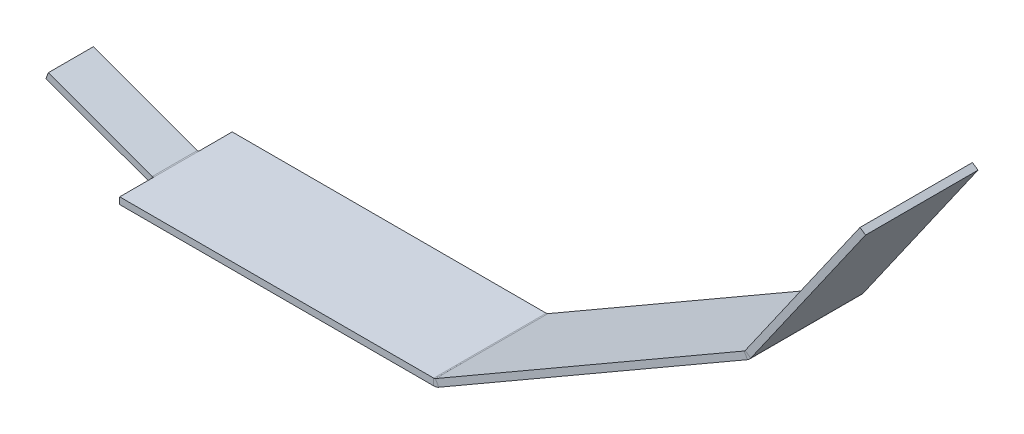
ISO-10303-21;
HEADER;
FILE_DESCRIPTION(('STEP AP214'),'2;1');
FILE_NAME('part.step','',(''),(''),'','','');
FILE_SCHEMA(('AUTOMOTIVE_DESIGN { 1 0 10303 214 1 1 1 1 }'));
ENDSEC;
DATA;
#1=APPLICATION_CONTEXT('core data for automotive mechanical design processes');
#2=APPLICATION_PROTOCOL_DEFINITION('international standard','automotive_design',2000,#1);
#3=PRODUCT_CONTEXT('',#1,'mechanical');
#4=PRODUCT('Part','Part','',(#3));
#5=PRODUCT_RELATED_PRODUCT_CATEGORY('part','',(#4));
#6=PRODUCT_DEFINITION_FORMATION('','',#4);
#7=PRODUCT_DEFINITION_CONTEXT('part definition',#1,'design');
#8=PRODUCT_DEFINITION('design','',#6,#7);
#9=PRODUCT_DEFINITION_SHAPE('','',#8);
#10=(LENGTH_UNIT() NAMED_UNIT(*) SI_UNIT(.MILLI.,.METRE.));
#11=(NAMED_UNIT(*) PLANE_ANGLE_UNIT() SI_UNIT($,.RADIAN.));
#12=(NAMED_UNIT(*) SI_UNIT($,.STERADIAN.) SOLID_ANGLE_UNIT());
#13=UNCERTAINTY_MEASURE_WITH_UNIT(LENGTH_MEASURE(1.E-05),#10,'distance_accuracy_value','');
#14=(GEOMETRIC_REPRESENTATION_CONTEXT(3) GLOBAL_UNCERTAINTY_ASSIGNED_CONTEXT((#13)) GLOBAL_UNIT_ASSIGNED_CONTEXT((#10,
#11,#12)) REPRESENTATION_CONTEXT('',''));
#15=CARTESIAN_POINT('',(0.,0.,0.));
#16=DIRECTION('',(0.,0.,1.));
#17=DIRECTION('',(1.,0.,0.));
#18=AXIS2_PLACEMENT_3D('',#15,#16,#17);
#19=CARTESIAN_POINT('',(35.75,-1.29903810567666,12.5));
#20=DIRECTION('',(0.,0.,-1.));
#21=DIRECTION('',(-1.,0.,0.));
#22=AXIS2_PLACEMENT_3D('',#19,#20,#21);
#23=PLANE('',#22);
#24=DIRECTION('',(0.499999999999991,-0.866025403784444,0.));
#25=VECTOR('',#24,1.);
#26=CARTESIAN_POINT('',(103.792533893113,39.7173879614248,12.5));
#27=LINE('',#26,#25);
#28=CARTESIAN_POINT('',(103.792533893113,39.7173879614248,12.5));
#29=VERTEX_POINT('',#28);
#30=CARTESIAN_POINT('',(104.542533893113,38.4183498557482,12.5));
#31=VERTEX_POINT('',#30);
#32=EDGE_CURVE('E245',#29,#31,#27,.T.);
#33=ORIENTED_EDGE('',*,*,#32,.F.);
#34=DIRECTION('',(-0.866025403784441,-0.499999999999995,0.));
#35=VECTOR('',#34,1.);
#36=CARTESIAN_POINT('',(35.,0.,12.5));
#37=LINE('',#36,#35);
#38=CARTESIAN_POINT('',(35.1709286248552,0.0986856875723796,12.5));
#39=VERTEX_POINT('',#38);
#40=EDGE_CURVE('E260',#29,#39,#37,.T.);
#41=ORIENTED_EDGE('',*,*,#40,.T.);
#42=DIRECTION('',(0.499999999999995,-0.866025403784441,0.));
#43=VECTOR('',#42,1.);
#44=CARTESIAN_POINT('',(35.1709286248552,0.0986856875723821,12.5));
#45=LINE('',#44,#43);
#46=CARTESIAN_POINT('',(35.9209286248552,-1.20035241810428,12.5));
#47=VERTEX_POINT('',#46);
#48=EDGE_CURVE('E248',#39,#47,#45,.T.);
#49=ORIENTED_EDGE('',*,*,#48,.T.);
#50=DIRECTION('',(-0.866025403784441,-0.499999999999995,0.));
#51=VECTOR('',#50,1.);
#52=CARTESIAN_POINT('',(35.75,-1.29903810567666,12.5));
#53=LINE('',#52,#51);
#54=EDGE_CURVE('E261',#31,#47,#53,.T.);
#55=ORIENTED_EDGE('',*,*,#54,.F.);
#56=EDGE_LOOP('',(#33,#41,#49,#55));
#57=FACE_BOUND('',#56,.T.);
#58=ADVANCED_FACE('F57',(#57),#23,.F.);
#59=CARTESIAN_POINT('',(104.683956091402,38.4999999999996,-12.5));
#60=DIRECTION('',(0.,0.,1.));
#61=DIRECTION('',(1.,0.,0.));
#62=AXIS2_PLACEMENT_3D('',#59,#60,#61);
#63=PLANE('',#62);
#64=DIRECTION('',(0.499999999999991,-0.866025403784444,0.));
#65=VECTOR('',#64,1.);
#66=CARTESIAN_POINT('',(103.792533893113,39.7173879614248,-12.5));
#67=LINE('',#66,#65);
#68=CARTESIAN_POINT('',(103.792533893113,39.7173879614248,-12.5));
#69=VERTEX_POINT('',#68);
#70=CARTESIAN_POINT('',(104.542533893113,38.4183498557482,-12.5));
#71=VERTEX_POINT('',#70);
#72=EDGE_CURVE('E239',#69,#71,#67,.T.);
#73=ORIENTED_EDGE('',*,*,#72,.T.);
#74=DIRECTION('',(0.866025403784441,0.499999999999995,0.));
#75=VECTOR('',#74,1.);
#76=CARTESIAN_POINT('',(104.683956091402,38.4999999999996,-12.5));
#77=LINE('',#76,#75);
#78=CARTESIAN_POINT('',(35.9209286248552,-1.20035241810429,-12.5));
#79=VERTEX_POINT('',#78);
#80=EDGE_CURVE('E263',#79,#71,#77,.T.);
#81=ORIENTED_EDGE('',*,*,#80,.F.);
#82=DIRECTION('',(0.499999999999995,-0.866025403784441,0.));
#83=VECTOR('',#82,1.);
#84=CARTESIAN_POINT('',(35.1709286248552,0.0986856875723821,-12.5));
#85=LINE('',#84,#83);
#86=CARTESIAN_POINT('',(35.1709286248552,0.0986856875723815,-12.5));
#87=VERTEX_POINT('',#86);
#88=EDGE_CURVE('E253',#87,#79,#85,.T.);
#89=ORIENTED_EDGE('',*,*,#88,.F.);
#90=DIRECTION('',(0.866025403784441,0.499999999999995,0.));
#91=VECTOR('',#90,1.);
#92=CARTESIAN_POINT('',(103.933956091402,39.7990381056763,-12.5));
#93=LINE('',#92,#91);
#94=EDGE_CURVE('E264',#87,#69,#93,.T.);
#95=ORIENTED_EDGE('',*,*,#94,.T.);
#96=EDGE_LOOP('',(#73,#81,#89,#95));
#97=FACE_BOUND('',#96,.T.);
#98=ADVANCED_FACE('F435',(#97),#63,.F.);
#99=CARTESIAN_POINT('',(9.49999999999982,-16.4544826719042,0.));
#100=DIRECTION('',(-0.499999999999995,0.866025403784442,0.));
#101=DIRECTION('',(-0.866025403784441,-0.499999999999995,0.));
#102=AXIS2_PLACEMENT_3D('',#99,#100,#101);
#103=PLANE('',#102);
#104=DIRECTION('',(0.,0.,-1.));
#105=VECTOR('',#104,1.);
#106=CARTESIAN_POINT('',(104.542533893113,38.4183498557482,-12.5));
#107=LINE('',#106,#105);
#108=EDGE_CURVE('E192',#71,#31,#107,.F.);
#109=ORIENTED_EDGE('',*,*,#108,.T.);
#110=ORIENTED_EDGE('',*,*,#54,.T.);
#111=DIRECTION('',(0.,0.,1.));
#112=VECTOR('',#111,1.);
#113=CARTESIAN_POINT('',(35.9209286248552,-1.20035241810429,0.));
#114=LINE('',#113,#112);
#115=EDGE_CURVE('E256',#79,#47,#114,.T.);
#116=ORIENTED_EDGE('',*,*,#115,.F.);
#117=ORIENTED_EDGE('',*,*,#80,.T.);
#118=EDGE_LOOP('',(#109,#110,#116,#117));
#119=FACE_BOUND('',#118,.T.);
#120=ADVANCED_FACE('F441',(#119),#103,.F.);
#121=CARTESIAN_POINT('',(8.74999999999982,-15.1554445662276,0.));
#122=DIRECTION('',(-0.499999999999995,0.866025403784442,0.));
#123=DIRECTION('',(-0.866025403784441,-0.499999999999995,0.));
#124=AXIS2_PLACEMENT_3D('',#121,#122,#123);
#125=PLANE('',#124);
#126=ORIENTED_EDGE('',*,*,#40,.F.);
#127=DIRECTION('',(0.,0.,-1.));
#128=VECTOR('',#127,1.);
#129=CARTESIAN_POINT('',(103.792533893113,39.7173879614248,-12.5));
#130=LINE('',#129,#128);
#131=EDGE_CURVE('E72',#69,#29,#130,.F.);
#132=ORIENTED_EDGE('',*,*,#131,.F.);
#133=ORIENTED_EDGE('',*,*,#94,.F.);
#134=DIRECTION('',(0.,0.,-1.));
#135=VECTOR('',#134,1.);
#136=CARTESIAN_POINT('',(35.1709286248552,0.0986856875723821,12.5));
#137=LINE('',#136,#135);
#138=EDGE_CURVE('E251',#39,#87,#137,.T.);
#139=ORIENTED_EDGE('',*,*,#138,.F.);
#140=EDGE_LOOP('',(#126,#132,#133,#139));
#141=FACE_BOUND('',#140,.T.);
#142=ADVANCED_FACE('F587',(#141),#125,.T.);
#143=CARTESIAN_POINT('',(-35.,-1.5,-12.5));
#144=DIRECTION('',(0.,0.,-1.));
#145=DIRECTION('',(-1.,0.,0.));
#146=AXIS2_PLACEMENT_3D('',#143,#144,#145);
#147=PLANE('',#146);
#148=DIRECTION('',(-1.,0.,0.));
#149=VECTOR('',#148,1.);
#150=CARTESIAN_POINT('',(-35.,0.,-12.5));
#151=LINE('',#150,#149);
#152=CARTESIAN_POINT('',(34.8026286248552,0.,-12.5));
#153=VERTEX_POINT('',#152);
#154=CARTESIAN_POINT('',(-35.,0.,-12.5));
#155=VERTEX_POINT('',#154);
#156=EDGE_CURVE('E337',#153,#155,#151,.T.);
#157=ORIENTED_EDGE('',*,*,#156,.F.);
#158=DIRECTION('',(0.,-1.,0.));
#159=VECTOR('',#158,1.);
#160=CARTESIAN_POINT('',(34.8026286248552,0.,-12.5));
#161=LINE('',#160,#159);
#162=CARTESIAN_POINT('',(34.8026286248552,-1.5,-12.5));
#163=VERTEX_POINT('',#162);
#164=EDGE_CURVE('E274',#153,#163,#161,.T.);
#165=ORIENTED_EDGE('',*,*,#164,.T.);
#166=DIRECTION('',(-1.,0.,0.));
#167=VECTOR('',#166,1.);
#168=CARTESIAN_POINT('',(-35.,-1.5,-12.5));
#169=LINE('',#168,#167);
#170=CARTESIAN_POINT('',(-35.,-1.5,-12.5));
#171=VERTEX_POINT('',#170);
#172=EDGE_CURVE('E340',#163,#171,#169,.T.);
#173=ORIENTED_EDGE('',*,*,#172,.T.);
#174=DIRECTION('',(0.,1.,0.));
#175=VECTOR('',#174,1.);
#176=CARTESIAN_POINT('',(-35.,-1.5,-12.5));
#177=LINE('',#176,#175);
#178=EDGE_CURVE('E61',#171,#155,#177,.T.);
#179=ORIENTED_EDGE('',*,*,#178,.T.);
#180=EDGE_LOOP('',(#157,#165,#173,#179));
#181=FACE_BOUND('',#180,.T.);
#182=ADVANCED_FACE('F59',(#181),#147,.T.);
#183=CARTESIAN_POINT('',(0.,-1.5,0.));
#184=DIRECTION('',(0.,-1.,0.));
#185=DIRECTION('',(0.,0.,-1.));
#186=AXIS2_PLACEMENT_3D('',#183,#184,#185);
#187=PLANE('',#186);
#188=ORIENTED_EDGE('',*,*,#172,.F.);
#189=DIRECTION('',(0.,0.,-1.));
#190=VECTOR('',#189,1.);
#191=CARTESIAN_POINT('',(34.8026286248552,-1.5,-12.5));
#192=LINE('',#191,#190);
#193=CARTESIAN_POINT('',(34.8026286248552,-1.5,12.5));
#194=VERTEX_POINT('',#193);
#195=EDGE_CURVE('E269',#163,#194,#192,.F.);
#196=ORIENTED_EDGE('',*,*,#195,.T.);
#197=DIRECTION('',(1.,0.,0.));
#198=VECTOR('',#197,1.);
#199=CARTESIAN_POINT('',(-35.,-1.5,12.5));
#200=LINE('',#199,#198);
#201=CARTESIAN_POINT('',(-35.,-1.5,12.5));
#202=VERTEX_POINT('',#201);
#203=EDGE_CURVE('E347',#202,#194,#200,.T.);
#204=ORIENTED_EDGE('',*,*,#203,.F.);
#205=DIRECTION('',(0.,0.,1.));
#206=VECTOR('',#205,1.);
#207=CARTESIAN_POINT('',(-35.,-1.5,12.5));
#208=LINE('',#207,#206);
#209=CARTESIAN_POINT('',(-35.,-1.5,5.));
#210=VERTEX_POINT('',#209);
#211=EDGE_CURVE('E342',#210,#202,#208,.T.);
#212=ORIENTED_EDGE('',*,*,#211,.F.);
#213=DIRECTION('',(0.,0.,1.));
#214=VECTOR('',#213,1.);
#215=CARTESIAN_POINT('',(-35.,-1.50000000000001,5.));
#216=LINE('',#215,#214);
#217=CARTESIAN_POINT('',(-35.,-1.5,-5.));
#218=VERTEX_POINT('',#217);
#219=EDGE_CURVE('E319',#210,#218,#216,.F.);
#220=ORIENTED_EDGE('',*,*,#219,.T.);
#221=EDGE_CURVE('E344',#171,#218,#208,.T.);
#222=ORIENTED_EDGE('',*,*,#221,.F.);
#223=EDGE_LOOP('',(#188,#196,#204,#212,#220,#222));
#224=FACE_BOUND('',#223,.T.);
#225=ADVANCED_FACE('F374',(#224),#187,.T.);
#226=CARTESIAN_POINT('',(0.,0.,0.));
#227=DIRECTION('',(0.,-1.,0.));
#228=DIRECTION('',(0.,0.,-1.));
#229=AXIS2_PLACEMENT_3D('',#226,#227,#228);
#230=PLANE('',#229);
#231=DIRECTION('',(0.,0.,-1.));
#232=VECTOR('',#231,1.);
#233=CARTESIAN_POINT('',(34.8026286248552,0.,-12.5));
#234=LINE('',#233,#232);
#235=CARTESIAN_POINT('',(34.8026286248552,0.,12.5));
#236=VERTEX_POINT('',#235);
#237=EDGE_CURVE('E280',#153,#236,#234,.F.);
#238=ORIENTED_EDGE('',*,*,#237,.F.);
#239=ORIENTED_EDGE('',*,*,#156,.T.);
#240=DIRECTION('',(0.,0.,1.));
#241=VECTOR('',#240,1.);
#242=CARTESIAN_POINT('',(-35.,0.,12.5));
#243=LINE('',#242,#241);
#244=CARTESIAN_POINT('',(-35.,0.,-5.));
#245=VERTEX_POINT('',#244);
#246=EDGE_CURVE('E352',#155,#245,#243,.T.);
#247=ORIENTED_EDGE('',*,*,#246,.T.);
#248=DIRECTION('',(0.,0.,1.));
#249=VECTOR('',#248,1.);
#250=CARTESIAN_POINT('',(-35.,0.,5.));
#251=LINE('',#250,#249);
#252=CARTESIAN_POINT('',(-35.,0.,5.));
#253=VERTEX_POINT('',#252);
#254=EDGE_CURVE('E331',#253,#245,#251,.F.);
#255=ORIENTED_EDGE('',*,*,#254,.F.);
#256=CARTESIAN_POINT('',(-35.,0.,12.5));
#257=VERTEX_POINT('',#256);
#258=EDGE_CURVE('E351',#253,#257,#243,.T.);
#259=ORIENTED_EDGE('',*,*,#258,.T.);
#260=DIRECTION('',(1.,0.,0.));
#261=VECTOR('',#260,1.);
#262=CARTESIAN_POINT('',(-35.,0.,12.5));
#263=LINE('',#262,#261);
#264=EDGE_CURVE('E343',#257,#236,#263,.T.);
#265=ORIENTED_EDGE('',*,*,#264,.T.);
#266=EDGE_LOOP('',(#238,#239,#247,#255,#259,#265));
#267=FACE_BOUND('',#266,.T.);
#268=ADVANCED_FACE('F360',(#267),#230,.F.);
#269=CARTESIAN_POINT('',(-35.,-1.5,12.5));
#270=DIRECTION('',(-1.,0.,0.));
#271=DIRECTION('',(0.,0.,1.));
#272=AXIS2_PLACEMENT_3D('',#269,#270,#271);
#273=PLANE('',#272);
#274=ORIENTED_EDGE('',*,*,#258,.F.);
#275=DIRECTION('',(0.,-1.,0.));
#276=VECTOR('',#275,1.);
#277=CARTESIAN_POINT('',(-35.,0.,5.));
#278=LINE('',#277,#276);
#279=EDGE_CURVE('E326',#253,#210,#278,.T.);
#280=ORIENTED_EDGE('',*,*,#279,.T.);
#281=ORIENTED_EDGE('',*,*,#211,.T.);
#282=DIRECTION('',(0.,1.,0.));
#283=VECTOR('',#282,1.);
#284=CARTESIAN_POINT('',(-35.,-1.5,12.5));
#285=LINE('',#284,#283);
#286=EDGE_CURVE('E13',#202,#257,#285,.T.);
#287=ORIENTED_EDGE('',*,*,#286,.T.);
#288=EDGE_LOOP('',(#274,#280,#281,#287));
#289=FACE_BOUND('',#288,.T.);
#290=ADVANCED_FACE('F399',(#289),#273,.T.);
#291=CARTESIAN_POINT('',(-35.,-1.5,12.5));
#292=DIRECTION('',(0.,0.,1.));
#293=DIRECTION('',(1.,0.,0.));
#294=AXIS2_PLACEMENT_3D('',#291,#292,#293);
#295=PLANE('',#294);
#296=DIRECTION('',(0.,-1.,0.));
#297=VECTOR('',#296,1.);
#298=CARTESIAN_POINT('',(34.8026286248552,0.,12.5));
#299=LINE('',#298,#297);
#300=EDGE_CURVE('E284',#236,#194,#299,.T.);
#301=ORIENTED_EDGE('',*,*,#300,.F.);
#302=ORIENTED_EDGE('',*,*,#264,.F.);
#303=ORIENTED_EDGE('',*,*,#286,.F.);
#304=ORIENTED_EDGE('',*,*,#203,.T.);
#305=EDGE_LOOP('',(#301,#302,#303,#304));
#306=FACE_BOUND('',#305,.T.);
#307=ADVANCED_FACE('F366',(#306),#295,.T.);
#308=DIRECTION('',(0.,-1.,0.));
#309=VECTOR('',#308,1.);
#310=CARTESIAN_POINT('',(-35.,0.,-5.));
#311=LINE('',#310,#309);
#312=EDGE_CURVE('E335',#245,#218,#311,.T.);
#313=ORIENTED_EDGE('',*,*,#312,.F.);
#314=ORIENTED_EDGE('',*,*,#246,.F.);
#315=ORIENTED_EDGE('',*,*,#178,.F.);
#316=ORIENTED_EDGE('',*,*,#221,.T.);
#317=EDGE_LOOP('',(#313,#314,#315,#316));
#318=FACE_BOUND('',#317,.T.);
#319=ADVANCED_FACE('F389',(#318),#273,.T.);
#320=CARTESIAN_POINT('',(-35.,0.736599999999975,-5.));
#321=DIRECTION('',(0.,0.,-1.));
#322=DIRECTION('',(0.,1.,0.));
#323=AXIS2_PLACEMENT_3D('',#320,#321,#322);
#324=PLANE('',#323);
#325=DIRECTION('',(0.342020143325664,0.93969262078591,0.));
#326=VECTOR('',#325,1.);
#327=CARTESIAN_POINT('',(-35.7649622525622,-1.36511651564977,-5.));
#328=LINE('',#327,#326);
#329=CARTESIAN_POINT('',(-35.2519320375737,0.0444224155290931,-5.));
#330=VERTEX_POINT('',#329);
#331=CARTESIAN_POINT('',(-35.7649622525622,-1.36511651564977,-5.));
#332=VERTEX_POINT('',#331);
#333=EDGE_CURVE('E286',#330,#332,#328,.F.);
#334=ORIENTED_EDGE('',*,*,#333,.F.);
#335=CARTESIAN_POINT('',(-35.,0.736599999999975,-5.));
#336=DIRECTION('',(0.,0.,1.));
#337=DIRECTION('',(0.,-1.,0.));
#338=AXIS2_PLACEMENT_3D('',#335,#336,#337);
#339=CIRCLE('',#338,0.736599999999979);
#340=EDGE_CURVE('E328',#245,#330,#339,.F.);
#341=ORIENTED_EDGE('',*,*,#340,.F.);
#342=ORIENTED_EDGE('',*,*,#312,.T.);
#343=CARTESIAN_POINT('',(-35.,0.736599999999975,-5.));
#344=DIRECTION('',(0.,0.,1.));
#345=DIRECTION('',(0.,-1.,0.));
#346=AXIS2_PLACEMENT_3D('',#343,#344,#345);
#347=CIRCLE('',#346,2.23659999999998);
#348=EDGE_CURVE('E322',#218,#332,#347,.F.);
#349=ORIENTED_EDGE('',*,*,#348,.T.);
#350=EDGE_LOOP('',(#334,#341,#342,#349));
#351=FACE_BOUND('',#350,.T.);
#352=ADVANCED_FACE('F393',(#351),#324,.T.);
#353=CARTESIAN_POINT('',(-35.,0.736599999999974,5.));
#354=DIRECTION('',(0.,0.,-1.));
#355=DIRECTION('',(0.,1.,0.));
#356=AXIS2_PLACEMENT_3D('',#353,#354,#355);
#357=PLANE('',#356);
#358=CARTESIAN_POINT('',(-35.,0.736599999999974,5.));
#359=DIRECTION('',(0.,0.,1.));
#360=DIRECTION('',(0.,-1.,0.));
#361=AXIS2_PLACEMENT_3D('',#358,#359,#360);
#362=CIRCLE('',#361,0.736599999999979);
#363=CARTESIAN_POINT('',(-35.2519320375737,0.0444224155290924,5.));
#364=VERTEX_POINT('',#363);
#365=EDGE_CURVE('E292',#364,#253,#362,.T.);
#366=ORIENTED_EDGE('',*,*,#365,.F.);
#367=DIRECTION('',(0.342020143325664,0.93969262078591,0.));
#368=VECTOR('',#367,1.);
#369=CARTESIAN_POINT('',(-35.2519320375737,0.0444224155290961,5.));
#370=LINE('',#369,#368);
#371=CARTESIAN_POINT('',(-35.7649622525622,-1.36511651564977,5.));
#372=VERTEX_POINT('',#371);
#373=EDGE_CURVE('E312',#364,#372,#370,.F.);
#374=ORIENTED_EDGE('',*,*,#373,.T.);
#375=CARTESIAN_POINT('',(-35.,0.736599999999974,5.));
#376=DIRECTION('',(0.,0.,1.));
#377=DIRECTION('',(0.,-1.,0.));
#378=AXIS2_PLACEMENT_3D('',#375,#376,#377);
#379=CIRCLE('',#378,2.23659999999998);
#380=EDGE_CURVE('E323',#372,#210,#379,.T.);
#381=ORIENTED_EDGE('',*,*,#380,.T.);
#382=ORIENTED_EDGE('',*,*,#279,.F.);
#383=EDGE_LOOP('',(#366,#374,#381,#382));
#384=FACE_BOUND('',#383,.T.);
#385=ADVANCED_FACE('F402',(#384),#357,.F.);
#386=CARTESIAN_POINT('',(-35.,0.736599999999974,5.));
#387=DIRECTION('',(0.,0.,1.));
#388=DIRECTION('',(-0.342020143325664,-0.93969262078591,0.));
#389=AXIS2_PLACEMENT_3D('',#386,#387,#388);
#390=CYLINDRICAL_SURFACE('',#389,2.23659999999998);
#391=ORIENTED_EDGE('',*,*,#219,.F.);
#392=ORIENTED_EDGE('',*,*,#380,.F.);
#393=DIRECTION('',(0.,0.,1.));
#394=VECTOR('',#393,1.);
#395=CARTESIAN_POINT('',(-35.7649622525622,-1.36511651564977,-5.));
#396=LINE('',#395,#394);
#397=EDGE_CURVE('E310',#372,#332,#396,.F.);
#398=ORIENTED_EDGE('',*,*,#397,.T.);
#399=ORIENTED_EDGE('',*,*,#348,.F.);
#400=EDGE_LOOP('',(#391,#392,#398,#399));
#401=FACE_BOUND('',#400,.T.);
#402=ADVANCED_FACE('F396',(#401),#390,.T.);
#403=CARTESIAN_POINT('',(-35.,0.736599999999974,5.));
#404=DIRECTION('',(0.,0.,1.));
#405=DIRECTION('',(-0.342020143325664,-0.93969262078591,0.));
#406=AXIS2_PLACEMENT_3D('',#403,#404,#405);
#407=CYLINDRICAL_SURFACE('',#406,0.736599999999979);
#408=ORIENTED_EDGE('',*,*,#254,.T.);
#409=ORIENTED_EDGE('',*,*,#340,.T.);
#410=DIRECTION('',(0.,0.,1.));
#411=VECTOR('',#410,1.);
#412=CARTESIAN_POINT('',(-35.2519320375737,0.0444224155290927,-5.));
#413=LINE('',#412,#411);
#414=EDGE_CURVE('E315',#330,#364,#413,.T.);
#415=ORIENTED_EDGE('',*,*,#414,.T.);
#416=ORIENTED_EDGE('',*,*,#365,.T.);
#417=EDGE_LOOP('',(#408,#409,#415,#416));
#418=FACE_BOUND('',#417,.T.);
#419=ADVANCED_FACE('F405',(#418),#407,.F.);
#420=CARTESIAN_POINT('',(-58.8866884447003,7.0505035831416,5.));
#421=DIRECTION('',(0.,0.,-1.));
#422=DIRECTION('',(-1.,0.,0.));
#423=AXIS2_PLACEMENT_3D('',#420,#421,#422);
#424=PLANE('',#423);
#425=ORIENTED_EDGE('',*,*,#373,.F.);
#426=DIRECTION('',(0.93969262078591,-0.342020143325664,0.));
#427=VECTOR('',#426,1.);
#428=CARTESIAN_POINT('',(-58.3736582297118,8.46004251432046,5.));
#429=LINE('',#428,#427);
#430=CARTESIAN_POINT('',(-58.3736582297118,8.46004251432046,5.));
#431=VERTEX_POINT('',#430);
#432=EDGE_CURVE('E308',#364,#431,#429,.F.);
#433=ORIENTED_EDGE('',*,*,#432,.T.);
#434=DIRECTION('',(0.342020143325664,0.93969262078591,0.));
#435=VECTOR('',#434,1.);
#436=CARTESIAN_POINT('',(-58.8866884447003,7.0505035831416,5.));
#437=LINE('',#436,#435);
#438=CARTESIAN_POINT('',(-58.8866884447003,7.05050358314159,5.));
#439=VERTEX_POINT('',#438);
#440=EDGE_CURVE('E289',#439,#431,#437,.T.);
#441=ORIENTED_EDGE('',*,*,#440,.F.);
#442=DIRECTION('',(-0.93969262078591,0.342020143325664,0.));
#443=VECTOR('',#442,1.);
#444=CARTESIAN_POINT('',(-4.73713491439612,-12.6583221006932,5.));
#445=LINE('',#444,#443);
#446=EDGE_CURVE('E301',#372,#439,#445,.T.);
#447=ORIENTED_EDGE('',*,*,#446,.F.);
#448=EDGE_LOOP('',(#425,#433,#441,#447));
#449=FACE_BOUND('',#448,.T.);
#450=ADVANCED_FACE('F422',(#449),#424,.F.);
#451=CARTESIAN_POINT('',(-35.6429126689784,-1.40953893117887,-5.));
#452=DIRECTION('',(0.,0.,1.));
#453=DIRECTION('',(1.,0.,0.));
#454=AXIS2_PLACEMENT_3D('',#451,#452,#453);
#455=PLANE('',#454);
#456=ORIENTED_EDGE('',*,*,#333,.T.);
#457=DIRECTION('',(0.93969262078591,-0.342020143325664,0.));
#458=VECTOR('',#457,1.);
#459=CARTESIAN_POINT('',(-4.73713491439612,-12.6583221006932,-5.));
#460=LINE('',#459,#458);
#461=CARTESIAN_POINT('',(-58.8866884447003,7.05050358314159,-5.));
#462=VERTEX_POINT('',#461);
#463=EDGE_CURVE('E296',#462,#332,#460,.T.);
#464=ORIENTED_EDGE('',*,*,#463,.F.);
#465=DIRECTION('',(0.342020143325664,0.93969262078591,0.));
#466=VECTOR('',#465,1.);
#467=CARTESIAN_POINT('',(-58.8866884447003,7.05050358314159,-5.));
#468=LINE('',#467,#466);
#469=CARTESIAN_POINT('',(-58.3736582297118,8.46004251432046,-5.));
#470=VERTEX_POINT('',#469);
#471=EDGE_CURVE('E293',#462,#470,#468,.T.);
#472=ORIENTED_EDGE('',*,*,#471,.T.);
#473=DIRECTION('',(-0.93969262078591,0.342020143325664,0.));
#474=VECTOR('',#473,1.);
#475=CARTESIAN_POINT('',(-35.1298824539899,0.,-5.));
#476=LINE('',#475,#474);
#477=EDGE_CURVE('E303',#470,#330,#476,.F.);
#478=ORIENTED_EDGE('',*,*,#477,.T.);
#479=EDGE_LOOP('',(#456,#464,#472,#478));
#480=FACE_BOUND('',#479,.T.);
#481=ADVANCED_FACE('F413',(#480),#455,.F.);
#482=CARTESIAN_POINT('',(-4.73713491439612,-12.6583221006932,0.));
#483=DIRECTION('',(0.342020143325664,0.93969262078591,0.));
#484=DIRECTION('',(-0.93969262078591,0.342020143325664,0.));
#485=AXIS2_PLACEMENT_3D('',#482,#483,#484);
#486=PLANE('',#485);
#487=ORIENTED_EDGE('',*,*,#397,.F.);
#488=ORIENTED_EDGE('',*,*,#446,.T.);
#489=DIRECTION('',(0.,0.,-1.));
#490=VECTOR('',#489,1.);
#491=CARTESIAN_POINT('',(-58.8866884447003,7.05050358314159,0.));
#492=LINE('',#491,#490);
#493=EDGE_CURVE('E299',#439,#462,#492,.T.);
#494=ORIENTED_EDGE('',*,*,#493,.T.);
#495=ORIENTED_EDGE('',*,*,#463,.T.);
#496=EDGE_LOOP('',(#487,#488,#494,#495));
#497=FACE_BOUND('',#496,.T.);
#498=ADVANCED_FACE('F424',(#497),#486,.F.);
#499=CARTESIAN_POINT('',(-4.22410469940762,-11.2487831695143,0.));
#500=DIRECTION('',(0.342020143325664,0.93969262078591,0.));
#501=DIRECTION('',(-0.93969262078591,0.342020143325664,0.));
#502=AXIS2_PLACEMENT_3D('',#499,#500,#501);
#503=PLANE('',#502);
#504=ORIENTED_EDGE('',*,*,#432,.F.);
#505=ORIENTED_EDGE('',*,*,#414,.F.);
#506=ORIENTED_EDGE('',*,*,#477,.F.);
#507=DIRECTION('',(0.,0.,1.));
#508=VECTOR('',#507,1.);
#509=CARTESIAN_POINT('',(-58.3736582297118,8.46004251432046,-5.));
#510=LINE('',#509,#508);
#511=EDGE_CURVE('E306',#431,#470,#510,.F.);
#512=ORIENTED_EDGE('',*,*,#511,.F.);
#513=EDGE_LOOP('',(#504,#505,#506,#512));
#514=FACE_BOUND('',#513,.T.);
#515=ADVANCED_FACE('F410',(#514),#503,.T.);
#516=CARTESIAN_POINT('',(-58.8866884447003,7.0505035831416,-5.));
#517=DIRECTION('',(0.93969262078591,-0.342020143325664,0.));
#518=DIRECTION('',(0.342020143325664,0.93969262078591,0.));
#519=AXIS2_PLACEMENT_3D('',#516,#517,#518);
#520=PLANE('',#519);
#521=ORIENTED_EDGE('',*,*,#511,.T.);
#522=ORIENTED_EDGE('',*,*,#471,.F.);
#523=ORIENTED_EDGE('',*,*,#493,.F.);
#524=ORIENTED_EDGE('',*,*,#440,.T.);
#525=EDGE_LOOP('',(#521,#522,#523,#524));
#526=FACE_BOUND('',#525,.T.);
#527=ADVANCED_FACE('F418',(#526),#520,.F.);
#528=CARTESIAN_POINT('',(34.8026286248552,0.736599999999999,12.5));
#529=DIRECTION('',(0.,0.,1.));
#530=DIRECTION('',(0.,-1.,0.));
#531=AXIS2_PLACEMENT_3D('',#528,#529,#530);
#532=PLANE('',#531);
#533=ORIENTED_EDGE('',*,*,#48,.F.);
#534=CARTESIAN_POINT('',(34.8026286248552,0.736599999999999,12.5));
#535=DIRECTION('',(0.,0.,-1.));
#536=DIRECTION('',(0.,1.,0.));
#537=AXIS2_PLACEMENT_3D('',#534,#535,#536);
#538=CIRCLE('',#537,0.736599999999999);
#539=EDGE_CURVE('E277',#236,#39,#538,.F.);
#540=ORIENTED_EDGE('',*,*,#539,.F.);
#541=ORIENTED_EDGE('',*,*,#300,.T.);
#542=CARTESIAN_POINT('',(34.8026286248552,0.736599999999999,12.5));
#543=DIRECTION('',(0.,0.,-1.));
#544=DIRECTION('',(0.,1.,0.));
#545=AXIS2_PLACEMENT_3D('',#542,#543,#544);
#546=CIRCLE('',#545,2.2366);
#547=EDGE_CURVE('E80',#194,#47,#546,.F.);
#548=ORIENTED_EDGE('',*,*,#547,.T.);
#549=EDGE_LOOP('',(#533,#540,#541,#548));
#550=FACE_BOUND('',#549,.T.);
#551=ADVANCED_FACE('F371',(#550),#532,.T.);
#552=CARTESIAN_POINT('',(34.8026286248552,0.736600000000001,-12.5));
#553=DIRECTION('',(0.,0.,1.));
#554=DIRECTION('',(0.,-1.,0.));
#555=AXIS2_PLACEMENT_3D('',#552,#553,#554);
#556=PLANE('',#555);
#557=CARTESIAN_POINT('',(34.8026286248552,0.736600000000001,-12.5));
#558=DIRECTION('',(0.,0.,-1.));
#559=DIRECTION('',(0.,1.,0.));
#560=AXIS2_PLACEMENT_3D('',#557,#558,#559);
#561=CIRCLE('',#560,0.736599999999999);
#562=EDGE_CURVE('E266',#87,#153,#561,.T.);
#563=ORIENTED_EDGE('',*,*,#562,.F.);
#564=ORIENTED_EDGE('',*,*,#88,.T.);
#565=CARTESIAN_POINT('',(34.8026286248552,0.736600000000001,-12.5));
#566=DIRECTION('',(0.,0.,-1.));
#567=DIRECTION('',(0.,1.,0.));
#568=AXIS2_PLACEMENT_3D('',#565,#566,#567);
#569=CIRCLE('',#568,2.2366);
#570=EDGE_CURVE('E272',#79,#163,#569,.T.);
#571=ORIENTED_EDGE('',*,*,#570,.T.);
#572=ORIENTED_EDGE('',*,*,#164,.F.);
#573=EDGE_LOOP('',(#563,#564,#571,#572));
#574=FACE_BOUND('',#573,.T.);
#575=ADVANCED_FACE('F380',(#574),#556,.F.);
#576=CARTESIAN_POINT('',(34.8026286248552,0.736600000000001,-12.5));
#577=DIRECTION('',(0.,0.,-1.));
#578=DIRECTION('',(0.499999999999995,-0.866025403784441,0.));
#579=AXIS2_PLACEMENT_3D('',#576,#577,#578);
#580=CYLINDRICAL_SURFACE('',#579,2.2366);
#581=ORIENTED_EDGE('',*,*,#195,.F.);
#582=ORIENTED_EDGE('',*,*,#570,.F.);
#583=ORIENTED_EDGE('',*,*,#115,.T.);
#584=ORIENTED_EDGE('',*,*,#547,.F.);
#585=EDGE_LOOP('',(#581,#582,#583,#584));
#586=FACE_BOUND('',#585,.T.);
#587=ADVANCED_FACE('F377',(#586),#580,.T.);
#588=CARTESIAN_POINT('',(34.8026286248552,0.736600000000001,-12.5));
#589=DIRECTION('',(0.,0.,-1.));
#590=DIRECTION('',(0.499999999999995,-0.866025403784441,0.));
#591=AXIS2_PLACEMENT_3D('',#588,#589,#590);
#592=CYLINDRICAL_SURFACE('',#591,0.736599999999999);
#593=ORIENTED_EDGE('',*,*,#237,.T.);
#594=ORIENTED_EDGE('',*,*,#539,.T.);
#595=ORIENTED_EDGE('',*,*,#138,.T.);
#596=ORIENTED_EDGE('',*,*,#562,.T.);
#597=EDGE_LOOP('',(#593,#594,#595,#596));
#598=FACE_BOUND('',#597,.T.);
#599=ADVANCED_FACE('F448',(#598),#592,.F.);
#600=CARTESIAN_POINT('',(103.424233893113,40.3553022738525,12.5));
#601=DIRECTION('',(0.,0.,1.));
#602=DIRECTION('',(1.,0.,0.));
#603=AXIS2_PLACEMENT_3D('',#600,#601,#602);
#604=PLANE('',#603);
#605=DIRECTION('',(0.819152044288985,-0.573576436351056,0.));
#606=VECTOR('',#605,1.);
#607=CARTESIAN_POINT('',(104.027621288937,39.9328058708363,12.5));
#608=LINE('',#607,#606);
#609=CARTESIAN_POINT('',(104.027621288937,39.9328058708363,12.5));
#610=VERTEX_POINT('',#609);
#611=CARTESIAN_POINT('',(105.25634935537,39.0724412163097,12.5));
#612=VERTEX_POINT('',#611);
#613=EDGE_CURVE('E764',#610,#612,#608,.T.);
#614=ORIENTED_EDGE('',*,*,#613,.F.);
#615=CARTESIAN_POINT('',(103.424233893113,40.3553022738525,12.5));
#616=DIRECTION('',(0.,0.,-1.));
#617=DIRECTION('',(-1.,0.,0.));
#618=AXIS2_PLACEMENT_3D('',#615,#616,#617);
#619=CIRCLE('',#618,0.736600000000015);
#620=EDGE_CURVE('E195',#29,#610,#619,.F.);
#621=ORIENTED_EDGE('',*,*,#620,.F.);
#622=ORIENTED_EDGE('',*,*,#32,.T.);
#623=CARTESIAN_POINT('',(103.424233893113,40.3553022738525,12.5));
#624=DIRECTION('',(0.,0.,-1.));
#625=DIRECTION('',(-1.,0.,0.));
#626=AXIS2_PLACEMENT_3D('',#623,#624,#625);
#627=CIRCLE('',#626,2.23660000000002);
#628=EDGE_CURVE('E238',#31,#612,#627,.F.);
#629=ORIENTED_EDGE('',*,*,#628,.T.);
#630=EDGE_LOOP('',(#614,#621,#622,#629));
#631=FACE_BOUND('',#630,.T.);
#632=ADVANCED_FACE('F451',(#631),#604,.T.);
#633=CARTESIAN_POINT('',(103.424233893113,40.3553022738525,-12.5));
#634=DIRECTION('',(0.,0.,1.));
#635=DIRECTION('',(1.,0.,0.));
#636=AXIS2_PLACEMENT_3D('',#633,#634,#635);
#637=PLANE('',#636);
#638=CARTESIAN_POINT('',(103.424233893113,40.3553022738525,-12.5));
#639=DIRECTION('',(0.,0.,-1.));
#640=DIRECTION('',(-1.,0.,0.));
#641=AXIS2_PLACEMENT_3D('',#638,#639,#640);
#642=CIRCLE('',#641,0.736600000000015);
#643=CARTESIAN_POINT('',(104.027621288937,39.9328058708363,-12.5));
#644=VERTEX_POINT('',#643);
#645=EDGE_CURVE('E202',#644,#69,#642,.T.);
#646=ORIENTED_EDGE('',*,*,#645,.F.);
#647=DIRECTION('',(0.819152044288985,-0.573576436351056,0.));
#648=VECTOR('',#647,1.);
#649=CARTESIAN_POINT('',(104.027621288937,39.9328058708363,-12.5));
#650=LINE('',#649,#648);
#651=CARTESIAN_POINT('',(105.25634935537,39.0724412163097,-12.5));
#652=VERTEX_POINT('',#651);
#653=EDGE_CURVE('E199',#644,#652,#650,.T.);
#654=ORIENTED_EDGE('',*,*,#653,.T.);
#655=CARTESIAN_POINT('',(103.424233893113,40.3553022738525,-12.5));
#656=DIRECTION('',(0.,0.,-1.));
#657=DIRECTION('',(-1.,0.,0.));
#658=AXIS2_PLACEMENT_3D('',#655,#656,#657);
#659=CIRCLE('',#658,2.23660000000002);
#660=EDGE_CURVE('E185',#652,#71,#659,.T.);
#661=ORIENTED_EDGE('',*,*,#660,.T.);
#662=ORIENTED_EDGE('',*,*,#72,.F.);
#663=EDGE_LOOP('',(#646,#654,#661,#662));
#664=FACE_BOUND('',#663,.T.);
#665=ADVANCED_FACE('F200',(#664),#637,.F.);
#666=CARTESIAN_POINT('',(103.424233893113,40.3553022738525,-12.5));
#667=DIRECTION('',(0.,0.,-1.));
#668=DIRECTION('',(0.819152044288985,-0.573576436351056,0.));
#669=AXIS2_PLACEMENT_3D('',#666,#667,#668);
#670=CYLINDRICAL_SURFACE('',#669,2.23660000000002);
#671=ORIENTED_EDGE('',*,*,#108,.F.);
#672=ORIENTED_EDGE('',*,*,#660,.F.);
#673=DIRECTION('',(0.,0.,1.));
#674=VECTOR('',#673,1.);
#675=CARTESIAN_POINT('',(105.25634935537,39.0724412163097,0.));
#676=LINE('',#675,#674);
#677=EDGE_CURVE('E190',#652,#612,#676,.T.);
#678=ORIENTED_EDGE('',*,*,#677,.T.);
#679=ORIENTED_EDGE('',*,*,#628,.F.);
#680=EDGE_LOOP('',(#671,#672,#678,#679));
#681=FACE_BOUND('',#680,.T.);
#682=ADVANCED_FACE('F187',(#681),#670,.T.);
#683=CARTESIAN_POINT('',(103.424233893113,40.3553022738525,-12.5));
#684=DIRECTION('',(0.,0.,-1.));
#685=DIRECTION('',(0.819152044288985,-0.573576436351056,0.));
#686=AXIS2_PLACEMENT_3D('',#683,#684,#685);
#687=CYLINDRICAL_SURFACE('',#686,0.736600000000015);
#688=ORIENTED_EDGE('',*,*,#131,.T.);
#689=ORIENTED_EDGE('',*,*,#620,.T.);
#690=DIRECTION('',(0.,0.,-1.));
#691=VECTOR('',#690,1.);
#692=CARTESIAN_POINT('',(104.027621288937,39.9328058708363,12.5));
#693=LINE('',#692,#691);
#694=EDGE_CURVE('E206',#610,#644,#693,.T.);
#695=ORIENTED_EDGE('',*,*,#694,.T.);
#696=ORIENTED_EDGE('',*,*,#645,.T.);
#697=EDGE_LOOP('',(#688,#689,#695,#696));
#698=FACE_BOUND('',#697,.T.);
#699=ADVANCED_FACE('F488',(#698),#687,.F.);
#700=CARTESIAN_POINT('',(130.782885541798,75.5281129899861,-12.5));
#701=DIRECTION('',(0.,0.,1.));
#702=DIRECTION('',(1.,0.,0.));
#703=AXIS2_PLACEMENT_3D('',#700,#701,#702);
#704=PLANE('',#703);
#705=ORIENTED_EDGE('',*,*,#653,.F.);
#706=DIRECTION('',(0.573576436351056,0.819152044288985,0.));
#707=VECTOR('',#706,1.);
#708=CARTESIAN_POINT('',(129.554157475364,76.3884776445127,-12.5));
#709=LINE('',#708,#707);
#710=CARTESIAN_POINT('',(129.554157475364,76.3884776445127,-12.5));
#711=VERTEX_POINT('',#710);
#712=EDGE_CURVE('E215',#644,#711,#709,.T.);
#713=ORIENTED_EDGE('',*,*,#712,.T.);
#714=DIRECTION('',(-0.819152044288985,0.573576436351056,0.));
#715=VECTOR('',#714,1.);
#716=CARTESIAN_POINT('',(130.782885541798,75.5281129899861,-12.5));
#717=LINE('',#716,#715);
#718=CARTESIAN_POINT('',(130.782885541798,75.5281129899861,-12.5));
#719=VERTEX_POINT('',#718);
#720=EDGE_CURVE('E220',#719,#711,#717,.T.);
#721=ORIENTED_EDGE('',*,*,#720,.F.);
#722=DIRECTION('',(0.573576436351056,0.819152044288985,0.));
#723=VECTOR('',#722,1.);
#724=CARTESIAN_POINT('',(130.782885541798,75.5281129899861,-12.5));
#725=LINE('',#724,#723);
#726=EDGE_CURVE('E211',#652,#719,#725,.T.);
#727=ORIENTED_EDGE('',*,*,#726,.F.);
#728=EDGE_LOOP('',(#705,#713,#721,#727));
#729=FACE_BOUND('',#728,.T.);
#730=ADVANCED_FACE('F218',(#729),#704,.F.);
#731=CARTESIAN_POINT('',(105.162684157835,38.9386734511497,12.5));
#732=DIRECTION('',(0.,0.,-1.));
#733=DIRECTION('',(-1.,0.,0.));
#734=AXIS2_PLACEMENT_3D('',#731,#732,#733);
#735=PLANE('',#734);
#736=ORIENTED_EDGE('',*,*,#613,.T.);
#737=DIRECTION('',(-0.573576436351056,-0.819152044288985,0.));
#738=VECTOR('',#737,1.);
#739=CARTESIAN_POINT('',(105.162684157835,38.9386734511497,12.5));
#740=LINE('',#739,#738);
#741=CARTESIAN_POINT('',(130.782885541798,75.5281129899861,12.5));
#742=VERTEX_POINT('',#741);
#743=EDGE_CURVE('E214',#742,#612,#740,.T.);
#744=ORIENTED_EDGE('',*,*,#743,.F.);
#745=DIRECTION('',(-0.819152044288985,0.573576436351056,0.));
#746=VECTOR('',#745,1.);
#747=CARTESIAN_POINT('',(130.782885541798,75.5281129899861,12.5));
#748=LINE('',#747,#746);
#749=CARTESIAN_POINT('',(129.554157475364,76.3884776445127,12.5));
#750=VERTEX_POINT('',#749);
#751=EDGE_CURVE('E231',#742,#750,#748,.T.);
#752=ORIENTED_EDGE('',*,*,#751,.T.);
#753=DIRECTION('',(-0.573576436351056,-0.819152044288985,0.));
#754=VECTOR('',#753,1.);
#755=CARTESIAN_POINT('',(103.933956091402,39.7990381056763,12.5));
#756=LINE('',#755,#754);
#757=EDGE_CURVE('E222',#750,#610,#756,.T.);
#758=ORIENTED_EDGE('',*,*,#757,.T.);
#759=EDGE_LOOP('',(#736,#744,#752,#758));
#760=FACE_BOUND('',#759,.T.);
#761=ADVANCED_FACE('F502',(#760),#735,.F.);
#762=CARTESIAN_POINT('',(52.2700281803851,-36.5998677543405,0.));
#763=DIRECTION('',(-0.819152044288985,0.573576436351056,0.));
#764=DIRECTION('',(-0.573576436351056,-0.819152044288985,0.));
#765=AXIS2_PLACEMENT_3D('',#762,#763,#764);
#766=PLANE('',#765);
#767=ORIENTED_EDGE('',*,*,#677,.F.);
#768=ORIENTED_EDGE('',*,*,#726,.T.);
#769=DIRECTION('',(0.,0.,1.));
#770=VECTOR('',#769,1.);
#771=CARTESIAN_POINT('',(130.782885541798,75.5281129899861,12.5));
#772=LINE('',#771,#770);
#773=EDGE_CURVE('E221',#719,#742,#772,.T.);
#774=ORIENTED_EDGE('',*,*,#773,.T.);
#775=ORIENTED_EDGE('',*,*,#743,.T.);
#776=EDGE_LOOP('',(#767,#768,#774,#775));
#777=FACE_BOUND('',#776,.T.);
#778=ADVANCED_FACE('F210',(#777),#766,.F.);
#779=CARTESIAN_POINT('',(51.0413001139516,-35.739503099814,0.));
#780=DIRECTION('',(-0.819152044288985,0.573576436351056,0.));
#781=DIRECTION('',(-0.573576436351056,-0.819152044288985,0.));
#782=AXIS2_PLACEMENT_3D('',#779,#780,#781);
#783=PLANE('',#782);
#784=ORIENTED_EDGE('',*,*,#712,.F.);
#785=ORIENTED_EDGE('',*,*,#694,.F.);
#786=ORIENTED_EDGE('',*,*,#757,.F.);
#787=DIRECTION('',(0.,0.,1.));
#788=VECTOR('',#787,1.);
#789=CARTESIAN_POINT('',(129.554157475364,76.3884776445127,12.5));
#790=LINE('',#789,#788);
#791=EDGE_CURVE('E226',#711,#750,#790,.T.);
#792=ORIENTED_EDGE('',*,*,#791,.F.);
#793=EDGE_LOOP('',(#784,#785,#786,#792));
#794=FACE_BOUND('',#793,.T.);
#795=ADVANCED_FACE('F516',(#794),#783,.T.);
#796=CARTESIAN_POINT('',(130.782885541798,75.5281129899861,12.5));
#797=DIRECTION('',(-0.573576436351056,-0.819152044288985,0.));
#798=DIRECTION('',(0.819152044288985,-0.573576436351056,0.));
#799=AXIS2_PLACEMENT_3D('',#796,#797,#798);
#800=PLANE('',#799);
#801=ORIENTED_EDGE('',*,*,#791,.T.);
#802=ORIENTED_EDGE('',*,*,#751,.F.);
#803=ORIENTED_EDGE('',*,*,#773,.F.);
#804=ORIENTED_EDGE('',*,*,#720,.T.);
#805=EDGE_LOOP('',(#801,#802,#803,#804));
#806=FACE_BOUND('',#805,.T.);
#807=ADVANCED_FACE('F523',(#806),#800,.F.);
#808=CLOSED_SHELL('',(#58,#98,#120,#142,#182,#225,#268,#290,#307,#319,#352,#385,#402,#419,#450,
#481,#498,#515,#527,#551,#575,#587,#599,#632,#665,#682,#699,#730,#761,#778,#795,#807));
#809=MANIFOLD_SOLID_BREP('B2',#808);
#810=ADVANCED_BREP_SHAPE_REPRESENTATION('',(#18,#809),#14);
#811=SHAPE_DEFINITION_REPRESENTATION(#9,#810);
ENDSEC;
END-ISO-10303-21;
